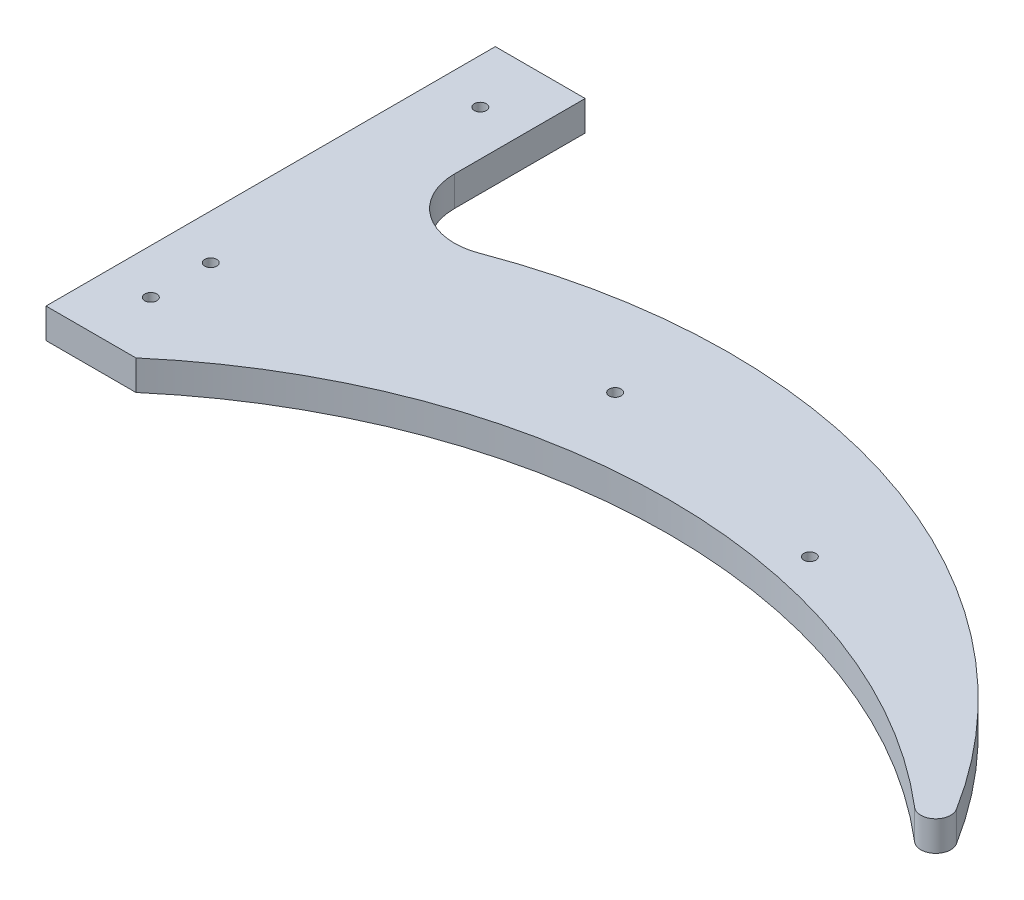
ISO-10303-21;
HEADER;
FILE_DESCRIPTION(('STEP AP214'),'2;1');
FILE_NAME('part.step','',(''),(''),'','','');
FILE_SCHEMA(('AUTOMOTIVE_DESIGN { 1 0 10303 214 1 1 1 1 }'));
ENDSEC;
DATA;
#1=APPLICATION_CONTEXT('core data for automotive mechanical design processes');
#2=APPLICATION_PROTOCOL_DEFINITION('international standard','automotive_design',2000,#1);
#3=PRODUCT_CONTEXT('',#1,'mechanical');
#4=PRODUCT('Part','Part','',(#3));
#5=PRODUCT_RELATED_PRODUCT_CATEGORY('part','',(#4));
#6=PRODUCT_DEFINITION_FORMATION('','',#4);
#7=PRODUCT_DEFINITION_CONTEXT('part definition',#1,'design');
#8=PRODUCT_DEFINITION('design','',#6,#7);
#9=PRODUCT_DEFINITION_SHAPE('','',#8);
#10=(LENGTH_UNIT() NAMED_UNIT(*) SI_UNIT(.MILLI.,.METRE.));
#11=(NAMED_UNIT(*) PLANE_ANGLE_UNIT() SI_UNIT($,.RADIAN.));
#12=(NAMED_UNIT(*) SI_UNIT($,.STERADIAN.) SOLID_ANGLE_UNIT());
#13=UNCERTAINTY_MEASURE_WITH_UNIT(LENGTH_MEASURE(1.E-05),#10,'distance_accuracy_value','');
#14=(GEOMETRIC_REPRESENTATION_CONTEXT(3) GLOBAL_UNCERTAINTY_ASSIGNED_CONTEXT((#13)) GLOBAL_UNIT_ASSIGNED_CONTEXT((#10,
#11,#12)) REPRESENTATION_CONTEXT('',''));
#15=CARTESIAN_POINT('',(0.,0.,0.));
#16=DIRECTION('',(0.,0.,1.));
#17=DIRECTION('',(1.,0.,0.));
#18=AXIS2_PLACEMENT_3D('',#15,#16,#17);
#19=CARTESIAN_POINT('',(65.,5.,75.9934207678533));
#20=DIRECTION('',(0.,-1.,0.));
#21=DIRECTION('',(0.,0.,-1.));
#22=AXIS2_PLACEMENT_3D('',#19,#20,#21);
#23=PLANE('',#22);
#24=CARTESIAN_POINT('',(65.,5.,75.9934207678533));
#25=DIRECTION('',(0.,-1.,0.));
#26=DIRECTION('',(0.,0.,-1.));
#27=AXIS2_PLACEMENT_3D('',#24,#25,#26);
#28=CIRCLE('',#27,100.);
#29=CARTESIAN_POINT('',(0.,5.,0.));
#30=VERTEX_POINT('',#29);
#31=CARTESIAN_POINT('',(130.,5.,0.));
#32=VERTEX_POINT('',#31);
#33=EDGE_CURVE('E145',#30,#32,#28,.T.);
#34=ORIENTED_EDGE('',*,*,#33,.T.);
#35=CARTESIAN_POINT('',(131.625,5.,-1.89983551919633));
#36=DIRECTION('',(0.,1.,0.));
#37=DIRECTION('',(0.,0.,1.));
#38=AXIS2_PLACEMENT_3D('',#35,#36,#37);
#39=CIRCLE('',#38,2.50000000000002);
#40=CARTESIAN_POINT('',(133.74584981047,5.,-3.22346540758243));
#41=VERTEX_POINT('',#40);
#42=EDGE_CURVE('E93',#32,#41,#39,.T.);
#43=ORIENTED_EDGE('',*,*,#42,.T.);
#44=CARTESIAN_POINT('',(48.911857391666,5.,49.7217301278605));
#45=DIRECTION('',(0.,1.,0.));
#46=DIRECTION('',(0.,0.,-1.));
#47=AXIS2_PLACEMENT_3D('',#44,#45,#46);
#48=CIRCLE('',#47,100.);
#49=CARTESIAN_POINT('',(13.5374415810605,5.,-43.8124919839333));
#50=VERTEX_POINT('',#49);
#51=EDGE_CURVE('E160',#41,#50,#48,.T.);
#52=ORIENTED_EDGE('',*,*,#51,.T.);
#53=CARTESIAN_POINT('',(10.,5.,-53.1659141951127));
#54=DIRECTION('',(0.,-1.,0.));
#55=DIRECTION('',(0.,0.,-1.));
#56=AXIS2_PLACEMENT_3D('',#53,#54,#55);
#57=CIRCLE('',#56,10.);
#58=CARTESIAN_POINT('',(0.,5.,-53.1659141951127));
#59=VERTEX_POINT('',#58);
#60=EDGE_CURVE('E173',#50,#59,#57,.T.);
#61=ORIENTED_EDGE('',*,*,#60,.T.);
#62=DIRECTION('',(0.,0.,-1.));
#63=VECTOR('',#62,1.);
#64=CARTESIAN_POINT('',(0.,5.,-75.));
#65=LINE('',#64,#63);
#66=CARTESIAN_POINT('',(0.,5.,-75.));
#67=VERTEX_POINT('',#66);
#68=EDGE_CURVE('E112',#59,#67,#65,.T.);
#69=ORIENTED_EDGE('',*,*,#68,.T.);
#70=DIRECTION('',(-1.,0.,0.));
#71=VECTOR('',#70,1.);
#72=CARTESIAN_POINT('',(0.,5.,-75.));
#73=LINE('',#72,#71);
#74=CARTESIAN_POINT('',(-15.,5.,-75.));
#75=VERTEX_POINT('',#74);
#76=EDGE_CURVE('E106',#67,#75,#73,.T.);
#77=ORIENTED_EDGE('',*,*,#76,.T.);
#78=DIRECTION('',(0.,0.,1.));
#79=VECTOR('',#78,1.);
#80=CARTESIAN_POINT('',(-15.,5.,0.));
#81=LINE('',#80,#79);
#82=CARTESIAN_POINT('',(-15.,5.,0.));
#83=VERTEX_POINT('',#82);
#84=EDGE_CURVE('E110',#75,#83,#81,.T.);
#85=ORIENTED_EDGE('',*,*,#84,.T.);
#86=DIRECTION('',(1.,0.,0.));
#87=VECTOR('',#86,1.);
#88=CARTESIAN_POINT('',(0.,5.,0.));
#89=LINE('',#88,#87);
#90=EDGE_CURVE('E50',#83,#30,#89,.T.);
#91=ORIENTED_EDGE('',*,*,#90,.T.);
#92=EDGE_LOOP('',(#34,#43,#52,#61,#69,#77,#85,#91));
#93=FACE_BOUND('',#92,.T.);
#94=CARTESIAN_POINT('',(-7.5,5.,-10.));
#95=DIRECTION('',(0.,1.,0.));
#96=DIRECTION('',(0.,0.,1.));
#97=AXIS2_PLACEMENT_3D('',#94,#95,#96);
#98=CIRCLE('',#97,1.);
#99=CARTESIAN_POINT('',(-7.5,5.,-9.));
#100=VERTEX_POINT('',#99);
#101=EDGE_CURVE('E134',#100,#100,#98,.T.);
#102=ORIENTED_EDGE('',*,*,#101,.F.);
#103=EDGE_LOOP('',(#102));
#104=FACE_BOUND('',#103,.T.);
#105=CARTESIAN_POINT('',(-7.5,5.,-20.));
#106=DIRECTION('',(0.,1.,0.));
#107=DIRECTION('',(0.,0.,1.));
#108=AXIS2_PLACEMENT_3D('',#105,#106,#107);
#109=CIRCLE('',#108,1.);
#110=CARTESIAN_POINT('',(-7.5,5.,-19.));
#111=VERTEX_POINT('',#110);
#112=EDGE_CURVE('E182',#111,#111,#109,.T.);
#113=ORIENTED_EDGE('',*,*,#112,.F.);
#114=EDGE_LOOP('',(#113));
#115=FACE_BOUND('',#114,.T.);
#116=CARTESIAN_POINT('',(-7.5,5.,-65.));
#117=DIRECTION('',(0.,1.,0.));
#118=DIRECTION('',(0.,0.,1.));
#119=AXIS2_PLACEMENT_3D('',#116,#117,#118);
#120=CIRCLE('',#119,1.);
#121=CARTESIAN_POINT('',(-7.5,5.,-64.));
#122=VERTEX_POINT('',#121);
#123=EDGE_CURVE('E188',#122,#122,#120,.T.);
#124=ORIENTED_EDGE('',*,*,#123,.F.);
#125=EDGE_LOOP('',(#124));
#126=FACE_BOUND('',#125,.T.);
#127=CARTESIAN_POINT('',(85.,5.,-27.5));
#128=DIRECTION('',(0.,1.,0.));
#129=DIRECTION('',(0.,0.,1.));
#130=AXIS2_PLACEMENT_3D('',#127,#128,#129);
#131=CIRCLE('',#130,0.999999999999998);
#132=CARTESIAN_POINT('',(85.,5.,-26.5));
#133=VERTEX_POINT('',#132);
#134=EDGE_CURVE('E194',#133,#133,#131,.T.);
#135=ORIENTED_EDGE('',*,*,#134,.F.);
#136=EDGE_LOOP('',(#135));
#137=FACE_BOUND('',#136,.T.);
#138=CARTESIAN_POINT('',(45.,5.,-35.));
#139=DIRECTION('',(0.,1.,0.));
#140=DIRECTION('',(0.,0.,1.));
#141=AXIS2_PLACEMENT_3D('',#138,#139,#140);
#142=CIRCLE('',#141,0.999999999999998);
#143=CARTESIAN_POINT('',(45.,5.,-34.));
#144=VERTEX_POINT('',#143);
#145=EDGE_CURVE('E200',#144,#144,#142,.T.);
#146=ORIENTED_EDGE('',*,*,#145,.F.);
#147=EDGE_LOOP('',(#146));
#148=FACE_BOUND('',#147,.T.);
#149=ADVANCED_FACE('F33',(#93,#104,#115,#126,#137,#148),#23,.F.);
#150=CARTESIAN_POINT('',(65.,0.,75.9934207678533));
#151=DIRECTION('',(0.,-1.,0.));
#152=DIRECTION('',(0.,0.,-1.));
#153=AXIS2_PLACEMENT_3D('',#150,#151,#152);
#154=PLANE('',#153);
#155=CARTESIAN_POINT('',(85.,0.,-27.5));
#156=DIRECTION('',(0.,1.,0.));
#157=DIRECTION('',(0.,0.,1.));
#158=AXIS2_PLACEMENT_3D('',#155,#156,#157);
#159=CIRCLE('',#158,0.999999999999998);
#160=CARTESIAN_POINT('',(85.,0.,-26.5));
#161=VERTEX_POINT('',#160);
#162=EDGE_CURVE('E197',#161,#161,#159,.T.);
#163=ORIENTED_EDGE('',*,*,#162,.T.);
#164=EDGE_LOOP('',(#163));
#165=FACE_BOUND('',#164,.T.);
#166=CARTESIAN_POINT('',(-7.5,0.,-20.));
#167=DIRECTION('',(0.,1.,0.));
#168=DIRECTION('',(0.,0.,1.));
#169=AXIS2_PLACEMENT_3D('',#166,#167,#168);
#170=CIRCLE('',#169,1.);
#171=CARTESIAN_POINT('',(-7.5,0.,-19.));
#172=VERTEX_POINT('',#171);
#173=EDGE_CURVE('E185',#172,#172,#170,.T.);
#174=ORIENTED_EDGE('',*,*,#173,.T.);
#175=EDGE_LOOP('',(#174));
#176=FACE_BOUND('',#175,.T.);
#177=CARTESIAN_POINT('',(65.,0.,75.9934207678533));
#178=DIRECTION('',(0.,-1.,0.));
#179=DIRECTION('',(0.,0.,-1.));
#180=AXIS2_PLACEMENT_3D('',#177,#178,#179);
#181=CIRCLE('',#180,100.);
#182=CARTESIAN_POINT('',(0.,0.,0.));
#183=VERTEX_POINT('',#182);
#184=CARTESIAN_POINT('',(130.,0.,0.));
#185=VERTEX_POINT('',#184);
#186=EDGE_CURVE('E130',#183,#185,#181,.T.);
#187=ORIENTED_EDGE('',*,*,#186,.F.);
#188=DIRECTION('',(1.,0.,0.));
#189=VECTOR('',#188,1.);
#190=CARTESIAN_POINT('',(0.,0.,0.));
#191=LINE('',#190,#189);
#192=CARTESIAN_POINT('',(-15.,0.,0.));
#193=VERTEX_POINT('',#192);
#194=EDGE_CURVE('E85',#193,#183,#191,.T.);
#195=ORIENTED_EDGE('',*,*,#194,.F.);
#196=DIRECTION('',(0.,0.,1.));
#197=VECTOR('',#196,1.);
#198=CARTESIAN_POINT('',(-15.,0.,0.));
#199=LINE('',#198,#197);
#200=CARTESIAN_POINT('',(-15.,0.,-75.));
#201=VERTEX_POINT('',#200);
#202=EDGE_CURVE('E79',#201,#193,#199,.T.);
#203=ORIENTED_EDGE('',*,*,#202,.F.);
#204=DIRECTION('',(-1.,0.,0.));
#205=VECTOR('',#204,1.);
#206=CARTESIAN_POINT('',(0.,0.,-75.));
#207=LINE('',#206,#205);
#208=CARTESIAN_POINT('',(0.,0.,-75.));
#209=VERTEX_POINT('',#208);
#210=EDGE_CURVE('E120',#209,#201,#207,.T.);
#211=ORIENTED_EDGE('',*,*,#210,.F.);
#212=DIRECTION('',(0.,0.,-1.));
#213=VECTOR('',#212,1.);
#214=CARTESIAN_POINT('',(0.,0.,-75.));
#215=LINE('',#214,#213);
#216=CARTESIAN_POINT('',(0.,0.,-53.1659141951127));
#217=VERTEX_POINT('',#216);
#218=EDGE_CURVE('E140',#217,#209,#215,.T.);
#219=ORIENTED_EDGE('',*,*,#218,.F.);
#220=CARTESIAN_POINT('',(10.,0.,-53.1659141951127));
#221=DIRECTION('',(0.,-1.,0.));
#222=DIRECTION('',(0.,0.,-1.));
#223=AXIS2_PLACEMENT_3D('',#220,#221,#222);
#224=CIRCLE('',#223,10.);
#225=CARTESIAN_POINT('',(13.5374415810605,0.,-43.8124919839333));
#226=VERTEX_POINT('',#225);
#227=EDGE_CURVE('E138',#226,#217,#224,.T.);
#228=ORIENTED_EDGE('',*,*,#227,.F.);
#229=CARTESIAN_POINT('',(48.911857391666,0.,49.7217301278605));
#230=DIRECTION('',(0.,1.,0.));
#231=DIRECTION('',(0.,0.,-1.));
#232=AXIS2_PLACEMENT_3D('',#229,#230,#231);
#233=CIRCLE('',#232,100.);
#234=CARTESIAN_POINT('',(133.74584981047,0.,-3.22346540758243));
#235=VERTEX_POINT('',#234);
#236=EDGE_CURVE('E136',#235,#226,#233,.T.);
#237=ORIENTED_EDGE('',*,*,#236,.F.);
#238=CARTESIAN_POINT('',(131.625,0.,-1.89983551919633));
#239=DIRECTION('',(0.,1.,0.));
#240=DIRECTION('',(0.,0.,1.));
#241=AXIS2_PLACEMENT_3D('',#238,#239,#240);
#242=CIRCLE('',#241,2.50000000000002);
#243=EDGE_CURVE('E133',#185,#235,#242,.T.);
#244=ORIENTED_EDGE('',*,*,#243,.F.);
#245=EDGE_LOOP('',(#187,#195,#203,#211,#219,#228,#237,#244));
#246=FACE_BOUND('',#245,.T.);
#247=CARTESIAN_POINT('',(-7.5,0.,-10.));
#248=DIRECTION('',(0.,1.,0.));
#249=DIRECTION('',(0.,0.,1.));
#250=AXIS2_PLACEMENT_3D('',#247,#248,#249);
#251=CIRCLE('',#250,1.);
#252=CARTESIAN_POINT('',(-7.5,0.,-9.));
#253=VERTEX_POINT('',#252);
#254=EDGE_CURVE('E179',#253,#253,#251,.T.);
#255=ORIENTED_EDGE('',*,*,#254,.T.);
#256=EDGE_LOOP('',(#255));
#257=FACE_BOUND('',#256,.T.);
#258=CARTESIAN_POINT('',(-7.5,0.,-65.));
#259=DIRECTION('',(0.,1.,0.));
#260=DIRECTION('',(0.,0.,1.));
#261=AXIS2_PLACEMENT_3D('',#258,#259,#260);
#262=CIRCLE('',#261,1.);
#263=CARTESIAN_POINT('',(-7.5,0.,-64.));
#264=VERTEX_POINT('',#263);
#265=EDGE_CURVE('E191',#264,#264,#262,.T.);
#266=ORIENTED_EDGE('',*,*,#265,.T.);
#267=EDGE_LOOP('',(#266));
#268=FACE_BOUND('',#267,.T.);
#269=CARTESIAN_POINT('',(45.,0.,-35.));
#270=DIRECTION('',(0.,1.,0.));
#271=DIRECTION('',(0.,0.,1.));
#272=AXIS2_PLACEMENT_3D('',#269,#270,#271);
#273=CIRCLE('',#272,0.999999999999998);
#274=CARTESIAN_POINT('',(45.,0.,-34.));
#275=VERTEX_POINT('',#274);
#276=EDGE_CURVE('E203',#275,#275,#273,.T.);
#277=ORIENTED_EDGE('',*,*,#276,.T.);
#278=EDGE_LOOP('',(#277));
#279=FACE_BOUND('',#278,.T.);
#280=ADVANCED_FACE('F164',(#165,#176,#246,#257,#268,#279),#154,.T.);
#281=CARTESIAN_POINT('',(65.,5.,75.9934207678533));
#282=DIRECTION('',(0.,-1.,0.));
#283=DIRECTION('',(0.,0.,-1.));
#284=AXIS2_PLACEMENT_3D('',#281,#282,#283);
#285=CYLINDRICAL_SURFACE('',#284,100.);
#286=ORIENTED_EDGE('',*,*,#186,.T.);
#287=DIRECTION('',(0.,-1.,0.));
#288=VECTOR('',#287,1.);
#289=CARTESIAN_POINT('',(130.,5.,0.));
#290=LINE('',#289,#288);
#291=EDGE_CURVE('E11',#32,#185,#290,.T.);
#292=ORIENTED_EDGE('',*,*,#291,.F.);
#293=ORIENTED_EDGE('',*,*,#33,.F.);
#294=DIRECTION('',(0.,-1.,0.));
#295=VECTOR('',#294,1.);
#296=CARTESIAN_POINT('',(0.,5.,0.));
#297=LINE('',#296,#295);
#298=EDGE_CURVE('E126',#30,#183,#297,.T.);
#299=ORIENTED_EDGE('',*,*,#298,.T.);
#300=EDGE_LOOP('',(#286,#292,#293,#299));
#301=FACE_BOUND('',#300,.T.);
#302=ADVANCED_FACE('F35',(#301),#285,.F.);
#303=CARTESIAN_POINT('',(131.625,5.,-1.89983551919633));
#304=DIRECTION('',(0.,-1.,0.));
#305=DIRECTION('',(0.,0.,-1.));
#306=AXIS2_PLACEMENT_3D('',#303,#304,#305);
#307=CYLINDRICAL_SURFACE('',#306,2.50000000000002);
#308=ORIENTED_EDGE('',*,*,#243,.T.);
#309=DIRECTION('',(0.,-1.,0.));
#310=VECTOR('',#309,1.);
#311=CARTESIAN_POINT('',(133.74584981047,5.,-3.22346540758243));
#312=LINE('',#311,#310);
#313=EDGE_CURVE('E42',#41,#235,#312,.T.);
#314=ORIENTED_EDGE('',*,*,#313,.F.);
#315=ORIENTED_EDGE('',*,*,#42,.F.);
#316=ORIENTED_EDGE('',*,*,#291,.T.);
#317=EDGE_LOOP('',(#308,#314,#315,#316));
#318=FACE_BOUND('',#317,.T.);
#319=ADVANCED_FACE('F235',(#318),#307,.T.);
#320=CARTESIAN_POINT('',(48.911857391666,5.,49.7217301278605));
#321=DIRECTION('',(0.,-1.,0.));
#322=DIRECTION('',(0.,0.,-1.));
#323=AXIS2_PLACEMENT_3D('',#320,#321,#322);
#324=CYLINDRICAL_SURFACE('',#323,100.);
#325=ORIENTED_EDGE('',*,*,#236,.T.);
#326=DIRECTION('',(0.,-1.,0.));
#327=VECTOR('',#326,1.);
#328=CARTESIAN_POINT('',(13.5374415810605,5.,-43.8124919839333));
#329=LINE('',#328,#327);
#330=EDGE_CURVE('E152',#50,#226,#329,.T.);
#331=ORIENTED_EDGE('',*,*,#330,.F.);
#332=ORIENTED_EDGE('',*,*,#51,.F.);
#333=ORIENTED_EDGE('',*,*,#313,.T.);
#334=EDGE_LOOP('',(#325,#331,#332,#333));
#335=FACE_BOUND('',#334,.T.);
#336=ADVANCED_FACE('F158',(#335),#324,.T.);
#337=CARTESIAN_POINT('',(10.,5.,-53.1659141951127));
#338=DIRECTION('',(0.,-1.,0.));
#339=DIRECTION('',(0.,0.,-1.));
#340=AXIS2_PLACEMENT_3D('',#337,#338,#339);
#341=CYLINDRICAL_SURFACE('',#340,10.);
#342=ORIENTED_EDGE('',*,*,#227,.T.);
#343=DIRECTION('',(0.,-1.,0.));
#344=VECTOR('',#343,1.);
#345=CARTESIAN_POINT('',(0.,5.,-53.1659141951127));
#346=LINE('',#345,#344);
#347=EDGE_CURVE('E149',#59,#217,#346,.T.);
#348=ORIENTED_EDGE('',*,*,#347,.F.);
#349=ORIENTED_EDGE('',*,*,#60,.F.);
#350=ORIENTED_EDGE('',*,*,#330,.T.);
#351=EDGE_LOOP('',(#342,#348,#349,#350));
#352=FACE_BOUND('',#351,.T.);
#353=ADVANCED_FACE('F169',(#352),#341,.F.);
#354=CARTESIAN_POINT('',(0.,5.,-75.));
#355=DIRECTION('',(-1.,0.,0.));
#356=DIRECTION('',(0.,0.,1.));
#357=AXIS2_PLACEMENT_3D('',#354,#355,#356);
#358=PLANE('',#357);
#359=ORIENTED_EDGE('',*,*,#218,.T.);
#360=DIRECTION('',(0.,-1.,0.));
#361=VECTOR('',#360,1.);
#362=CARTESIAN_POINT('',(0.,5.,-75.));
#363=LINE('',#362,#361);
#364=EDGE_CURVE('E121',#67,#209,#363,.T.);
#365=ORIENTED_EDGE('',*,*,#364,.F.);
#366=ORIENTED_EDGE('',*,*,#68,.F.);
#367=ORIENTED_EDGE('',*,*,#347,.T.);
#368=EDGE_LOOP('',(#359,#365,#366,#367));
#369=FACE_BOUND('',#368,.T.);
#370=ADVANCED_FACE('F172',(#369),#358,.F.);
#371=CARTESIAN_POINT('',(0.,5.,-75.));
#372=DIRECTION('',(0.,0.,1.));
#373=DIRECTION('',(1.,0.,0.));
#374=AXIS2_PLACEMENT_3D('',#371,#372,#373);
#375=PLANE('',#374);
#376=ORIENTED_EDGE('',*,*,#210,.T.);
#377=DIRECTION('',(0.,-1.,0.));
#378=VECTOR('',#377,1.);
#379=CARTESIAN_POINT('',(-15.,5.,-75.));
#380=LINE('',#379,#378);
#381=EDGE_CURVE('E117',#75,#201,#380,.T.);
#382=ORIENTED_EDGE('',*,*,#381,.F.);
#383=ORIENTED_EDGE('',*,*,#76,.F.);
#384=ORIENTED_EDGE('',*,*,#364,.T.);
#385=EDGE_LOOP('',(#376,#382,#383,#384));
#386=FACE_BOUND('',#385,.T.);
#387=ADVANCED_FACE('F118',(#386),#375,.F.);
#388=CARTESIAN_POINT('',(-15.,5.,0.));
#389=DIRECTION('',(1.,0.,0.));
#390=DIRECTION('',(0.,0.,-1.));
#391=AXIS2_PLACEMENT_3D('',#388,#389,#390);
#392=PLANE('',#391);
#393=ORIENTED_EDGE('',*,*,#202,.T.);
#394=DIRECTION('',(0.,-1.,0.));
#395=VECTOR('',#394,1.);
#396=CARTESIAN_POINT('',(-15.,5.,0.));
#397=LINE('',#396,#395);
#398=EDGE_CURVE('E122',#83,#193,#397,.T.);
#399=ORIENTED_EDGE('',*,*,#398,.F.);
#400=ORIENTED_EDGE('',*,*,#84,.F.);
#401=ORIENTED_EDGE('',*,*,#381,.T.);
#402=EDGE_LOOP('',(#393,#399,#400,#401));
#403=FACE_BOUND('',#402,.T.);
#404=ADVANCED_FACE('F124',(#403),#392,.F.);
#405=CARTESIAN_POINT('',(0.,5.,0.));
#406=DIRECTION('',(0.,0.,-1.));
#407=DIRECTION('',(-1.,0.,0.));
#408=AXIS2_PLACEMENT_3D('',#405,#406,#407);
#409=PLANE('',#408);
#410=ORIENTED_EDGE('',*,*,#194,.T.);
#411=ORIENTED_EDGE('',*,*,#298,.F.);
#412=ORIENTED_EDGE('',*,*,#90,.F.);
#413=ORIENTED_EDGE('',*,*,#398,.T.);
#414=EDGE_LOOP('',(#410,#411,#412,#413));
#415=FACE_BOUND('',#414,.T.);
#416=ADVANCED_FACE('F223',(#415),#409,.F.);
#417=CARTESIAN_POINT('',(-7.5,5.,-10.));
#418=DIRECTION('',(0.,-1.,0.));
#419=DIRECTION('',(0.,0.,-1.));
#420=AXIS2_PLACEMENT_3D('',#417,#418,#419);
#421=CYLINDRICAL_SURFACE('',#420,1.);
#422=ORIENTED_EDGE('',*,*,#101,.T.);
#423=EDGE_LOOP('',(#422));
#424=FACE_BOUND('',#423,.T.);
#425=ORIENTED_EDGE('',*,*,#254,.F.);
#426=EDGE_LOOP('',(#425));
#427=FACE_BOUND('',#426,.T.);
#428=ADVANCED_FACE('F220',(#424,#427),#421,.F.);
#429=CARTESIAN_POINT('',(-7.5,5.,-20.));
#430=DIRECTION('',(0.,-1.,0.));
#431=DIRECTION('',(0.,0.,-1.));
#432=AXIS2_PLACEMENT_3D('',#429,#430,#431);
#433=CYLINDRICAL_SURFACE('',#432,1.);
#434=ORIENTED_EDGE('',*,*,#112,.T.);
#435=EDGE_LOOP('',(#434));
#436=FACE_BOUND('',#435,.T.);
#437=ORIENTED_EDGE('',*,*,#173,.F.);
#438=EDGE_LOOP('',(#437));
#439=FACE_BOUND('',#438,.T.);
#440=ADVANCED_FACE('F299',(#436,#439),#433,.F.);
#441=CARTESIAN_POINT('',(-7.5,5.,-65.));
#442=DIRECTION('',(0.,-1.,0.));
#443=DIRECTION('',(0.,0.,-1.));
#444=AXIS2_PLACEMENT_3D('',#441,#442,#443);
#445=CYLINDRICAL_SURFACE('',#444,1.);
#446=ORIENTED_EDGE('',*,*,#123,.T.);
#447=EDGE_LOOP('',(#446));
#448=FACE_BOUND('',#447,.T.);
#449=ORIENTED_EDGE('',*,*,#265,.F.);
#450=EDGE_LOOP('',(#449));
#451=FACE_BOUND('',#450,.T.);
#452=ADVANCED_FACE('F307',(#448,#451),#445,.F.);
#453=CARTESIAN_POINT('',(85.,5.,-27.5));
#454=DIRECTION('',(0.,-1.,0.));
#455=DIRECTION('',(0.,0.,-1.));
#456=AXIS2_PLACEMENT_3D('',#453,#454,#455);
#457=CYLINDRICAL_SURFACE('',#456,0.999999999999998);
#458=ORIENTED_EDGE('',*,*,#134,.T.);
#459=EDGE_LOOP('',(#458));
#460=FACE_BOUND('',#459,.T.);
#461=ORIENTED_EDGE('',*,*,#162,.F.);
#462=EDGE_LOOP('',(#461));
#463=FACE_BOUND('',#462,.T.);
#464=ADVANCED_FACE('F315',(#460,#463),#457,.F.);
#465=CARTESIAN_POINT('',(45.,5.,-35.));
#466=DIRECTION('',(0.,-1.,0.));
#467=DIRECTION('',(0.,0.,-1.));
#468=AXIS2_PLACEMENT_3D('',#465,#466,#467);
#469=CYLINDRICAL_SURFACE('',#468,0.999999999999998);
#470=ORIENTED_EDGE('',*,*,#145,.T.);
#471=EDGE_LOOP('',(#470));
#472=FACE_BOUND('',#471,.T.);
#473=ORIENTED_EDGE('',*,*,#276,.F.);
#474=EDGE_LOOP('',(#473));
#475=FACE_BOUND('',#474,.T.);
#476=ADVANCED_FACE('F209',(#472,#475),#469,.F.);
#477=CLOSED_SHELL('',(#149,#280,#302,#319,#336,#353,#370,#387,#404,#416,#428,#440,#452,#464,#476));
#478=MANIFOLD_SOLID_BREP('B2',#477);
#479=ADVANCED_BREP_SHAPE_REPRESENTATION('',(#18,#478),#14);
#480=SHAPE_DEFINITION_REPRESENTATION(#9,#479);
ENDSEC;
END-ISO-10303-21;
